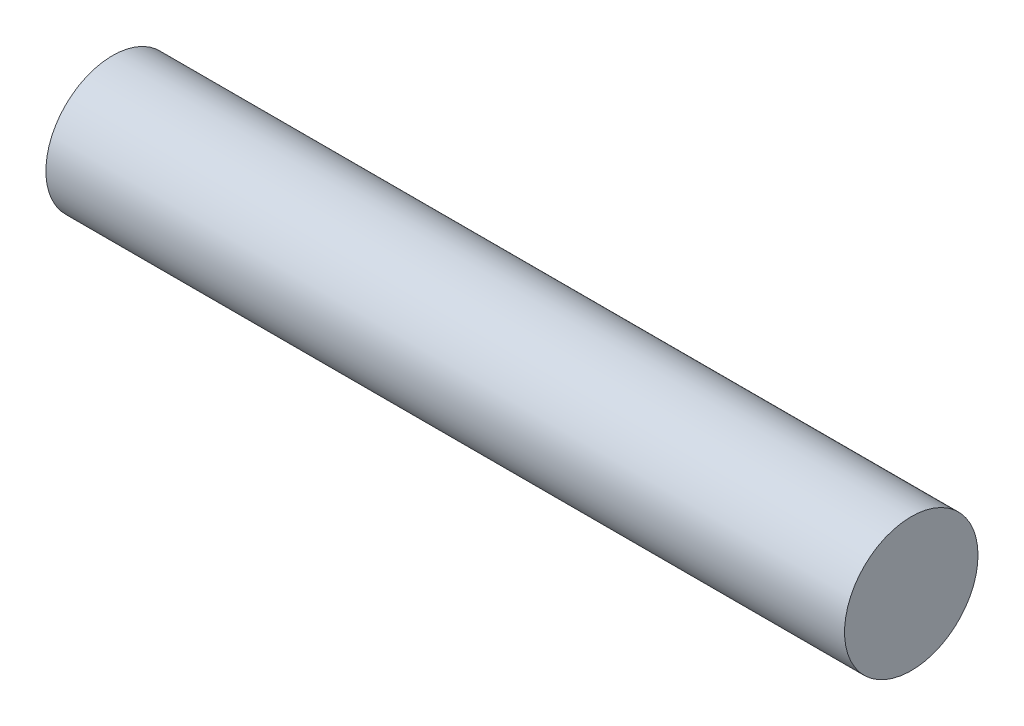
ISO-10303-21;
HEADER;
FILE_DESCRIPTION(('STEP AP214'),'2;1');
FILE_NAME('part.step','',(''),(''),'','','');
FILE_SCHEMA(('AUTOMOTIVE_DESIGN { 1 0 10303 214 1 1 1 1 }'));
ENDSEC;
DATA;
#1=APPLICATION_CONTEXT('core data for automotive mechanical design processes');
#2=APPLICATION_PROTOCOL_DEFINITION('international standard','automotive_design',2000,#1);
#3=PRODUCT_CONTEXT('',#1,'mechanical');
#4=PRODUCT('Part','Part','',(#3));
#5=PRODUCT_RELATED_PRODUCT_CATEGORY('part','',(#4));
#6=PRODUCT_DEFINITION_FORMATION('','',#4);
#7=PRODUCT_DEFINITION_CONTEXT('part definition',#1,'design');
#8=PRODUCT_DEFINITION('design','',#6,#7);
#9=PRODUCT_DEFINITION_SHAPE('','',#8);
#10=(LENGTH_UNIT() NAMED_UNIT(*) SI_UNIT(.MILLI.,.METRE.));
#11=(NAMED_UNIT(*) PLANE_ANGLE_UNIT() SI_UNIT($,.RADIAN.));
#12=(NAMED_UNIT(*) SI_UNIT($,.STERADIAN.) SOLID_ANGLE_UNIT());
#13=UNCERTAINTY_MEASURE_WITH_UNIT(LENGTH_MEASURE(1.E-05),#10,'distance_accuracy_value','');
#14=(GEOMETRIC_REPRESENTATION_CONTEXT(3) GLOBAL_UNCERTAINTY_ASSIGNED_CONTEXT((#13)) GLOBAL_UNIT_ASSIGNED_CONTEXT((#10,
#11,#12)) REPRESENTATION_CONTEXT('',''));
#15=CARTESIAN_POINT('',(0.,0.,0.));
#16=DIRECTION('',(0.,0.,1.));
#17=DIRECTION('',(1.,0.,0.));
#18=AXIS2_PLACEMENT_3D('',#15,#16,#17);
#19=CARTESIAN_POINT('',(-3.19999999999996,0.,0.));
#20=DIRECTION('',(1.,0.,0.));
#21=DIRECTION('',(0.,0.,-1.));
#22=AXIS2_PLACEMENT_3D('',#19,#20,#21);
#23=CYLINDRICAL_SURFACE('',#22,8.89);
#24=CARTESIAN_POINT('',(-3.19999999999996,0.,0.));
#25=DIRECTION('',(1.,0.,0.));
#26=DIRECTION('',(0.,0.,-1.));
#27=AXIS2_PLACEMENT_3D('',#24,#25,#26);
#28=CIRCLE('',#27,8.89);
#29=CARTESIAN_POINT('',(-3.19999999999996,0.,-8.89));
#30=VERTEX_POINT('',#29);
#31=EDGE_CURVE('E10',#30,#30,#28,.T.);
#32=ORIENTED_EDGE('',*,*,#31,.T.);
#33=EDGE_LOOP('',(#32));
#34=FACE_BOUND('',#33,.T.);
#35=CARTESIAN_POINT('',(103.2,0.,0.));
#36=DIRECTION('',(1.,0.,0.));
#37=DIRECTION('',(0.,0.,-1.));
#38=AXIS2_PLACEMENT_3D('',#35,#36,#37);
#39=CIRCLE('',#38,8.89);
#40=CARTESIAN_POINT('',(103.2,0.,-8.89));
#41=VERTEX_POINT('',#40);
#42=EDGE_CURVE('E47',#41,#41,#39,.T.);
#43=ORIENTED_EDGE('',*,*,#42,.F.);
#44=EDGE_LOOP('',(#43));
#45=FACE_BOUND('',#44,.T.);
#46=ADVANCED_FACE('F41',(#34,#45),#23,.T.);
#47=CARTESIAN_POINT('',(-3.19999999999996,0.,0.));
#48=DIRECTION('',(1.,0.,0.));
#49=DIRECTION('',(0.,0.,-1.));
#50=AXIS2_PLACEMENT_3D('',#47,#48,#49);
#51=PLANE('',#50);
#52=ORIENTED_EDGE('',*,*,#31,.F.);
#53=EDGE_LOOP('',(#52));
#54=FACE_BOUND('',#53,.T.);
#55=ADVANCED_FACE('F56',(#54),#51,.F.);
#56=CARTESIAN_POINT('',(103.2,0.,0.));
#57=DIRECTION('',(1.,0.,0.));
#58=DIRECTION('',(0.,0.,-1.));
#59=AXIS2_PLACEMENT_3D('',#56,#57,#58);
#60=PLANE('',#59);
#61=ORIENTED_EDGE('',*,*,#42,.T.);
#62=EDGE_LOOP('',(#61));
#63=FACE_BOUND('',#62,.T.);
#64=ADVANCED_FACE('F53',(#63),#60,.T.);
#65=CLOSED_SHELL('',(#46,#55,#64));
#66=MANIFOLD_SOLID_BREP('B2',#65);
#67=ADVANCED_BREP_SHAPE_REPRESENTATION('',(#18,#66),#14);
#68=SHAPE_DEFINITION_REPRESENTATION(#9,#67);
ENDSEC;
END-ISO-10303-21;
